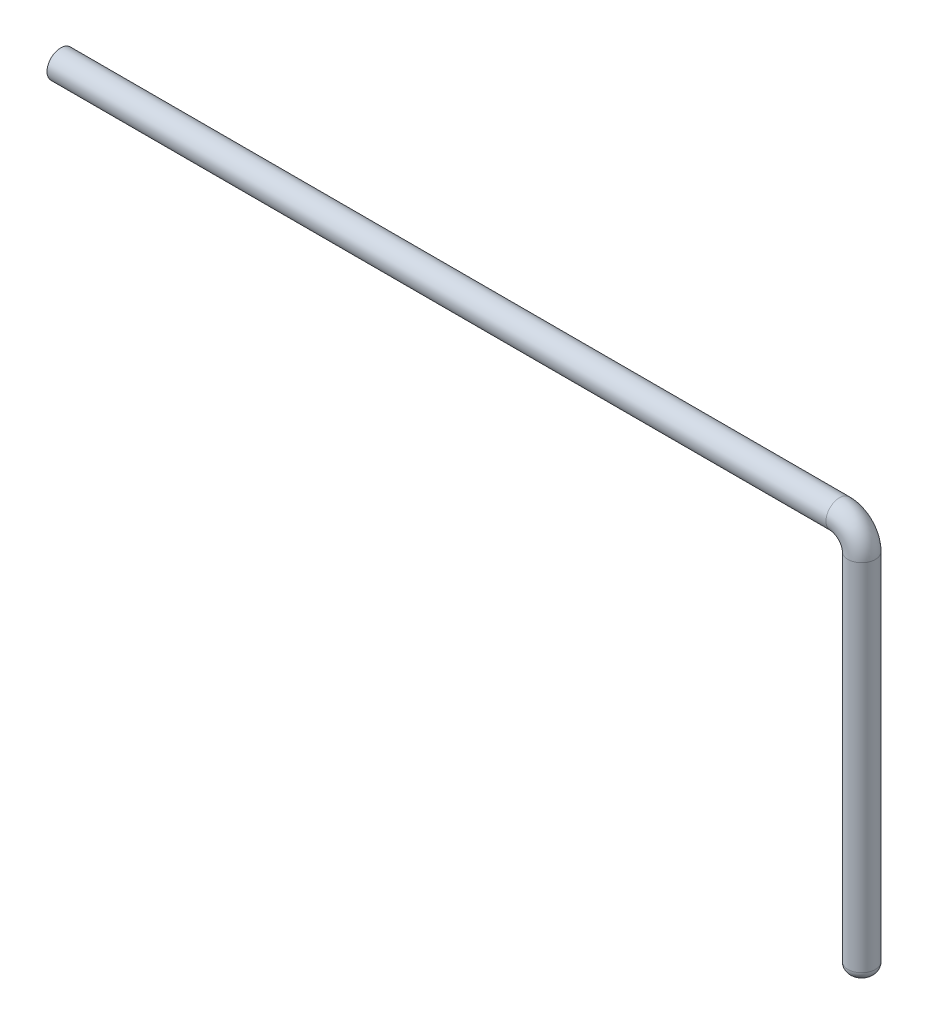
ISO-10303-21;
HEADER;
FILE_DESCRIPTION(('STEP AP214'),'2;1');
FILE_NAME('part.step','',(''),(''),'','','');
FILE_SCHEMA(('AUTOMOTIVE_DESIGN { 1 0 10303 214 1 1 1 1 }'));
ENDSEC;
DATA;
#1=APPLICATION_CONTEXT('core data for automotive mechanical design processes');
#2=APPLICATION_PROTOCOL_DEFINITION('international standard','automotive_design',2000,#1);
#3=PRODUCT_CONTEXT('',#1,'mechanical');
#4=PRODUCT('Part','Part','',(#3));
#5=PRODUCT_RELATED_PRODUCT_CATEGORY('part','',(#4));
#6=PRODUCT_DEFINITION_FORMATION('','',#4);
#7=PRODUCT_DEFINITION_CONTEXT('part definition',#1,'design');
#8=PRODUCT_DEFINITION('design','',#6,#7);
#9=PRODUCT_DEFINITION_SHAPE('','',#8);
#10=(LENGTH_UNIT() NAMED_UNIT(*) SI_UNIT(.MILLI.,.METRE.));
#11=(NAMED_UNIT(*) PLANE_ANGLE_UNIT() SI_UNIT($,.RADIAN.));
#12=(NAMED_UNIT(*) SI_UNIT($,.STERADIAN.) SOLID_ANGLE_UNIT());
#13=UNCERTAINTY_MEASURE_WITH_UNIT(LENGTH_MEASURE(1.E-05),#10,'distance_accuracy_value','');
#14=(GEOMETRIC_REPRESENTATION_CONTEXT(3) GLOBAL_UNCERTAINTY_ASSIGNED_CONTEXT((#13)) GLOBAL_UNIT_ASSIGNED_CONTEXT((#10,
#11,#12)) REPRESENTATION_CONTEXT('',''));
#15=CARTESIAN_POINT('',(0.,0.,0.));
#16=DIRECTION('',(0.,0.,1.));
#17=DIRECTION('',(1.,0.,0.));
#18=AXIS2_PLACEMENT_3D('',#15,#16,#17);
#19=CARTESIAN_POINT('',(19.4019047619048,21.8895238095238,0.));
#20=DIRECTION('',(-1.,0.,0.));
#21=DIRECTION('',(0.,0.,1.));
#22=AXIS2_PLACEMENT_3D('',#19,#20,#21);
#23=PLANE('',#22);
#24=CARTESIAN_POINT('',(19.4019047619048,21.8895238095238,0.));
#25=DIRECTION('',(-1.,0.,0.));
#26=DIRECTION('',(0.,0.,1.));
#27=AXIS2_PLACEMENT_3D('',#24,#25,#26);
#28=CIRCLE('',#27,0.309999999999998);
#29=CARTESIAN_POINT('',(19.4019047619048,21.8895238095238,0.309999999999998));
#30=VERTEX_POINT('',#29);
#31=EDGE_CURVE('E67',#30,#30,#28,.T.);
#32=ORIENTED_EDGE('',*,*,#31,.T.);
#33=EDGE_LOOP('',(#32));
#34=FACE_BOUND('',#33,.T.);
#35=ADVANCED_FACE('F47',(#34),#23,.T.);
#36=CARTESIAN_POINT('',(37.5619047619048,13.1395238095238,0.));
#37=DIRECTION('',(0.,1.,0.));
#38=DIRECTION('',(0.,0.,1.));
#39=AXIS2_PLACEMENT_3D('',#36,#37,#38);
#40=PLANE('',#39);
#41=CARTESIAN_POINT('',(37.5619047619048,13.1395238095238,0.));
#42=DIRECTION('',(0.,1.,0.));
#43=DIRECTION('',(0.,0.,1.));
#44=AXIS2_PLACEMENT_3D('',#41,#42,#43);
#45=CIRCLE('',#44,0.109999999999998);
#46=CARTESIAN_POINT('',(37.5619047619048,13.1395238095238,0.109999999999998));
#47=VERTEX_POINT('',#46);
#48=EDGE_CURVE('E11',#47,#47,#45,.F.);
#49=ORIENTED_EDGE('',*,*,#48,.T.);
#50=EDGE_LOOP('',(#49));
#51=FACE_BOUND('',#50,.T.);
#52=ADVANCED_FACE('F75',(#51),#40,.F.);
#53=CARTESIAN_POINT('',(19.4019047619048,21.8895238095238,0.));
#54=DIRECTION('',(1.,0.,0.));
#55=DIRECTION('',(0.,0.,-1.));
#56=AXIS2_PLACEMENT_3D('',#53,#54,#55);
#57=CYLINDRICAL_SURFACE('',#56,0.309999999999998);
#58=CARTESIAN_POINT('',(37.0619047619048,21.8895238095238,0.));
#59=DIRECTION('',(-1.,0.,0.));
#60=DIRECTION('',(0.,0.,1.));
#61=AXIS2_PLACEMENT_3D('',#58,#59,#60);
#62=CIRCLE('',#61,0.309999999999998);
#63=CARTESIAN_POINT('',(37.0619047619048,22.1995238095238,0.));
#64=VERTEX_POINT('',#63);
#65=EDGE_CURVE('E62',#64,#64,#62,.T.);
#66=ORIENTED_EDGE('',*,*,#65,.T.);
#67=EDGE_LOOP('',(#66));
#68=FACE_BOUND('',#67,.T.);
#69=ORIENTED_EDGE('',*,*,#31,.F.);
#70=EDGE_LOOP('',(#69));
#71=FACE_BOUND('',#70,.T.);
#72=ADVANCED_FACE('F72',(#68,#71),#57,.T.);
#73=CARTESIAN_POINT('',(37.0619047619048,21.3895238095238,0.));
#74=DIRECTION('',(0.,0.,-1.));
#75=DIRECTION('',(-1.,0.,0.));
#76=AXIS2_PLACEMENT_3D('',#73,#74,#75);
#77=TOROIDAL_SURFACE('',#76,0.5,0.309999999999998);
#78=CARTESIAN_POINT('',(37.5619047619048,21.3895238095238,0.));
#79=DIRECTION('',(0.,1.,0.));
#80=DIRECTION('',(0.,0.,1.));
#81=AXIS2_PLACEMENT_3D('',#78,#79,#80);
#82=CIRCLE('',#81,0.309999999999998);
#83=CARTESIAN_POINT('',(37.8719047619048,21.3895238095238,0.));
#84=VERTEX_POINT('',#83);
#85=EDGE_CURVE('E58',#84,#84,#82,.T.);
#86=CARTESIAN_POINT('',(37.0619047619048,21.3895238095238,0.));
#87=DIRECTION('',(0.,0.,-1.));
#88=DIRECTION('',(-1.,0.,0.));
#89=AXIS2_PLACEMENT_3D('',#86,#87,#88);
#90=CIRCLE('',#89,0.809999999999998);
#91=EDGE_CURVE('',#64,#84,#90,.T.);
#92=ORIENTED_EDGE('',*,*,#65,.F.);
#93=ORIENTED_EDGE('',*,*,#85,.T.);
#94=ORIENTED_EDGE('',*,*,#91,.T.);
#95=ORIENTED_EDGE('',*,*,#91,.F.);
#96=EDGE_LOOP('',(#92,#94,#93,#95));
#97=FACE_BOUND('',#96,.T.);
#98=ADVANCED_FACE('F74',(#97),#77,.T.);
#99=CARTESIAN_POINT('',(37.5619047619048,21.3895238095238,0.));
#100=DIRECTION('',(0.,-1.,0.));
#101=DIRECTION('',(0.,0.,-1.));
#102=AXIS2_PLACEMENT_3D('',#99,#100,#101);
#103=CYLINDRICAL_SURFACE('',#102,0.309999999999998);
#104=CARTESIAN_POINT('',(37.5619047619048,13.3395238095238,0.));
#105=DIRECTION('',(0.,1.,0.));
#106=DIRECTION('',(0.,0.,1.));
#107=AXIS2_PLACEMENT_3D('',#104,#105,#106);
#108=CIRCLE('',#107,0.309999999999998);
#109=CARTESIAN_POINT('',(37.5619047619048,13.3395238095238,0.309999999999998));
#110=VERTEX_POINT('',#109);
#111=EDGE_CURVE('E54',#110,#110,#108,.T.);
#112=ORIENTED_EDGE('',*,*,#111,.T.);
#113=EDGE_LOOP('',(#112));
#114=FACE_BOUND('',#113,.T.);
#115=ORIENTED_EDGE('',*,*,#85,.F.);
#116=EDGE_LOOP('',(#115));
#117=FACE_BOUND('',#116,.T.);
#118=ADVANCED_FACE('F82',(#114,#117),#103,.T.);
#119=CARTESIAN_POINT('',(37.5619047619048,13.3395238095238,0.));
#120=DIRECTION('',(0.,1.,0.));
#121=DIRECTION('',(0.,0.,1.));
#122=AXIS2_PLACEMENT_3D('',#119,#120,#121);
#123=DEGENERATE_TOROIDAL_SURFACE('',#122,0.109999999999998,0.2,.T.);
#124=ORIENTED_EDGE('',*,*,#48,.F.);
#125=EDGE_LOOP('',(#124));
#126=FACE_BOUND('',#125,.T.);
#127=ORIENTED_EDGE('',*,*,#111,.F.);
#128=EDGE_LOOP('',(#127));
#129=FACE_BOUND('',#128,.T.);
#130=ADVANCED_FACE('F49',(#126,#129),#123,.T.);
#131=CLOSED_SHELL('',(#35,#52,#72,#98,#118,#130));
#132=MANIFOLD_SOLID_BREP('B2',#131);
#133=ADVANCED_BREP_SHAPE_REPRESENTATION('',(#18,#132),#14);
#134=SHAPE_DEFINITION_REPRESENTATION(#9,#133);
ENDSEC;
END-ISO-10303-21;
